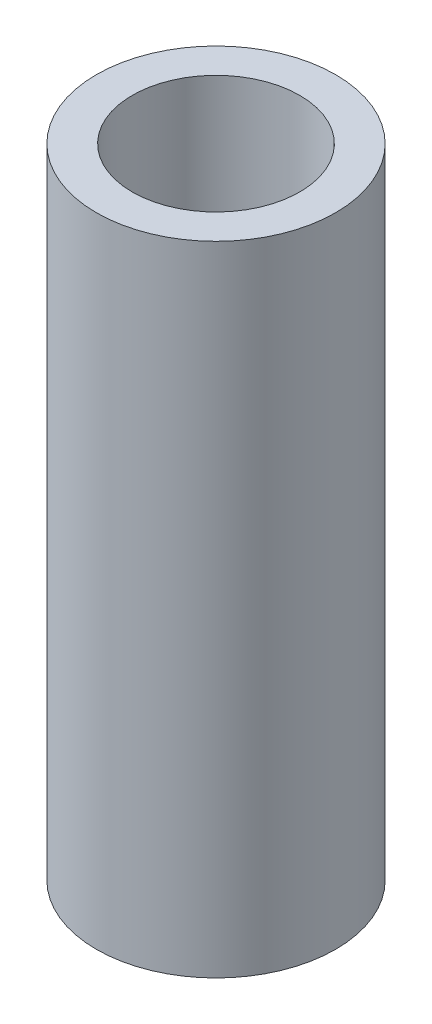
ISO-10303-21;
HEADER;
FILE_DESCRIPTION(('STEP AP214'),'2;1');
FILE_NAME('part.step','',(''),(''),'','','');
FILE_SCHEMA(('AUTOMOTIVE_DESIGN { 1 0 10303 214 1 1 1 1 }'));
ENDSEC;
DATA;
#1=APPLICATION_CONTEXT('core data for automotive mechanical design processes');
#2=APPLICATION_PROTOCOL_DEFINITION('international standard','automotive_design',2000,#1);
#3=PRODUCT_CONTEXT('',#1,'mechanical');
#4=PRODUCT('Part','Part','',(#3));
#5=PRODUCT_RELATED_PRODUCT_CATEGORY('part','',(#4));
#6=PRODUCT_DEFINITION_FORMATION('','',#4);
#7=PRODUCT_DEFINITION_CONTEXT('part definition',#1,'design');
#8=PRODUCT_DEFINITION('design','',#6,#7);
#9=PRODUCT_DEFINITION_SHAPE('','',#8);
#10=(LENGTH_UNIT() NAMED_UNIT(*) SI_UNIT(.MILLI.,.METRE.));
#11=(NAMED_UNIT(*) PLANE_ANGLE_UNIT() SI_UNIT($,.RADIAN.));
#12=(NAMED_UNIT(*) SI_UNIT($,.STERADIAN.) SOLID_ANGLE_UNIT());
#13=UNCERTAINTY_MEASURE_WITH_UNIT(LENGTH_MEASURE(1.E-05),#10,'distance_accuracy_value','');
#14=(GEOMETRIC_REPRESENTATION_CONTEXT(3) GLOBAL_UNCERTAINTY_ASSIGNED_CONTEXT((#13)) GLOBAL_UNIT_ASSIGNED_CONTEXT((#10,
#11,#12)) REPRESENTATION_CONTEXT('',''));
#15=CARTESIAN_POINT('',(0.,0.,0.));
#16=DIRECTION('',(0.,0.,1.));
#17=DIRECTION('',(1.,0.,0.));
#18=AXIS2_PLACEMENT_3D('',#15,#16,#17);
#19=CARTESIAN_POINT('',(0.,16.,0.));
#20=DIRECTION('',(0.,1.,0.));
#21=DIRECTION('',(0.,0.,1.));
#22=AXIS2_PLACEMENT_3D('',#19,#20,#21);
#23=PLANE('',#22);
#24=CARTESIAN_POINT('',(0.,16.,0.));
#25=DIRECTION('',(0.,1.,0.));
#26=DIRECTION('',(0.,0.,1.));
#27=AXIS2_PLACEMENT_3D('',#24,#25,#26);
#28=CIRCLE('',#27,3.);
#29=CARTESIAN_POINT('',(0.,16.,3.));
#30=VERTEX_POINT('',#29);
#31=EDGE_CURVE('E10',#30,#30,#28,.T.);
#32=ORIENTED_EDGE('',*,*,#31,.T.);
#33=EDGE_LOOP('',(#32));
#34=FACE_BOUND('',#33,.T.);
#35=CARTESIAN_POINT('',(0.,16.,0.));
#36=DIRECTION('',(0.,1.,0.));
#37=DIRECTION('',(0.,0.,1.));
#38=AXIS2_PLACEMENT_3D('',#35,#36,#37);
#39=CIRCLE('',#38,2.1);
#40=CARTESIAN_POINT('',(0.,16.,2.1));
#41=VERTEX_POINT('',#40);
#42=EDGE_CURVE('E42',#41,#41,#39,.T.);
#43=ORIENTED_EDGE('',*,*,#42,.F.);
#44=EDGE_LOOP('',(#43));
#45=FACE_BOUND('',#44,.T.);
#46=ADVANCED_FACE('F31',(#34,#45),#23,.T.);
#47=CARTESIAN_POINT('',(0.,0.,0.));
#48=DIRECTION('',(0.,1.,0.));
#49=DIRECTION('',(0.,0.,1.));
#50=AXIS2_PLACEMENT_3D('',#47,#48,#49);
#51=PLANE('',#50);
#52=CARTESIAN_POINT('',(0.,0.,0.));
#53=DIRECTION('',(0.,1.,0.));
#54=DIRECTION('',(0.,0.,1.));
#55=AXIS2_PLACEMENT_3D('',#52,#53,#54);
#56=CIRCLE('',#55,3.);
#57=CARTESIAN_POINT('',(0.,0.,3.));
#58=VERTEX_POINT('',#57);
#59=EDGE_CURVE('E35',#58,#58,#56,.T.);
#60=ORIENTED_EDGE('',*,*,#59,.F.);
#61=EDGE_LOOP('',(#60));
#62=FACE_BOUND('',#61,.T.);
#63=CARTESIAN_POINT('',(0.,0.,0.));
#64=DIRECTION('',(0.,1.,0.));
#65=DIRECTION('',(0.,0.,1.));
#66=AXIS2_PLACEMENT_3D('',#63,#64,#65);
#67=CIRCLE('',#66,2.1);
#68=CARTESIAN_POINT('',(0.,0.,2.1));
#69=VERTEX_POINT('',#68);
#70=EDGE_CURVE('E44',#69,#69,#67,.T.);
#71=ORIENTED_EDGE('',*,*,#70,.T.);
#72=EDGE_LOOP('',(#71));
#73=FACE_BOUND('',#72,.T.);
#74=ADVANCED_FACE('F54',(#62,#73),#51,.F.);
#75=CARTESIAN_POINT('',(0.,16.,0.));
#76=DIRECTION('',(0.,-1.,0.));
#77=DIRECTION('',(0.,0.,-1.));
#78=AXIS2_PLACEMENT_3D('',#75,#76,#77);
#79=CYLINDRICAL_SURFACE('',#78,3.);
#80=ORIENTED_EDGE('',*,*,#31,.F.);
#81=EDGE_LOOP('',(#80));
#82=FACE_BOUND('',#81,.T.);
#83=ORIENTED_EDGE('',*,*,#59,.T.);
#84=EDGE_LOOP('',(#83));
#85=FACE_BOUND('',#84,.T.);
#86=ADVANCED_FACE('F33',(#82,#85),#79,.T.);
#87=CARTESIAN_POINT('',(0.,16.,0.));
#88=DIRECTION('',(0.,-1.,0.));
#89=DIRECTION('',(0.,0.,-1.));
#90=AXIS2_PLACEMENT_3D('',#87,#88,#89);
#91=CYLINDRICAL_SURFACE('',#90,2.1);
#92=ORIENTED_EDGE('',*,*,#42,.T.);
#93=EDGE_LOOP('',(#92));
#94=FACE_BOUND('',#93,.T.);
#95=ORIENTED_EDGE('',*,*,#70,.F.);
#96=EDGE_LOOP('',(#95));
#97=FACE_BOUND('',#96,.T.);
#98=ADVANCED_FACE('F50',(#94,#97),#91,.F.);
#99=CLOSED_SHELL('',(#46,#74,#86,#98));
#100=MANIFOLD_SOLID_BREP('B2',#99);
#101=ADVANCED_BREP_SHAPE_REPRESENTATION('',(#18,#100),#14);
#102=SHAPE_DEFINITION_REPRESENTATION(#9,#101);
ENDSEC;
END-ISO-10303-21;
